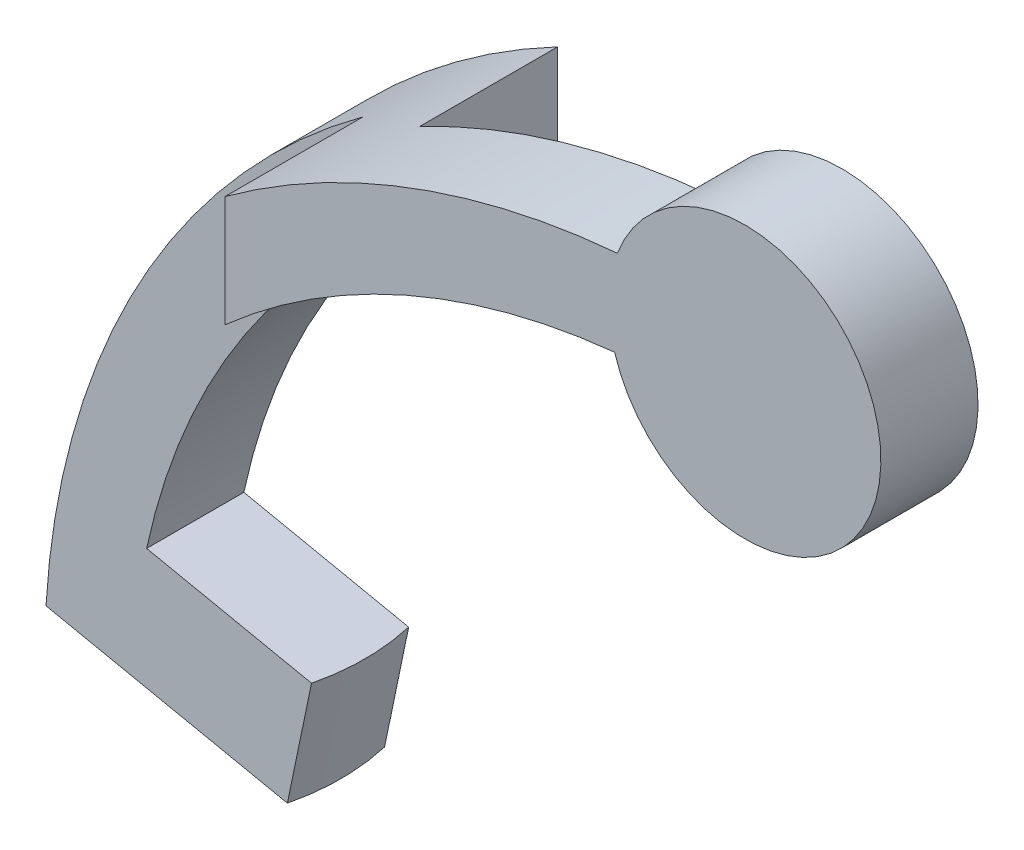
ISO-10303-21;
HEADER;
FILE_DESCRIPTION(('STEP AP214'),'2;1');
FILE_NAME('part.step','',(''),(''),'','','');
FILE_SCHEMA(('AUTOMOTIVE_DESIGN { 1 0 10303 214 1 1 1 1 }'));
ENDSEC;
DATA;
#1=APPLICATION_CONTEXT('core data for automotive mechanical design processes');
#2=APPLICATION_PROTOCOL_DEFINITION('international standard','automotive_design',2000,#1);
#3=PRODUCT_CONTEXT('',#1,'mechanical');
#4=PRODUCT('Part','Part','',(#3));
#5=PRODUCT_RELATED_PRODUCT_CATEGORY('part','',(#4));
#6=PRODUCT_DEFINITION_FORMATION('','',#4);
#7=PRODUCT_DEFINITION_CONTEXT('part definition',#1,'design');
#8=PRODUCT_DEFINITION('design','',#6,#7);
#9=PRODUCT_DEFINITION_SHAPE('','',#8);
#10=(LENGTH_UNIT() NAMED_UNIT(*) SI_UNIT(.MILLI.,.METRE.));
#11=(NAMED_UNIT(*) PLANE_ANGLE_UNIT() SI_UNIT($,.RADIAN.));
#12=(NAMED_UNIT(*) SI_UNIT($,.STERADIAN.) SOLID_ANGLE_UNIT());
#13=UNCERTAINTY_MEASURE_WITH_UNIT(LENGTH_MEASURE(1.E-05),#10,'distance_accuracy_value','');
#14=(GEOMETRIC_REPRESENTATION_CONTEXT(3) GLOBAL_UNCERTAINTY_ASSIGNED_CONTEXT((#13)) GLOBAL_UNIT_ASSIGNED_CONTEXT((#10,
#11,#12)) REPRESENTATION_CONTEXT('',''));
#15=CARTESIAN_POINT('',(0.,0.,0.));
#16=DIRECTION('',(0.,0.,1.));
#17=DIRECTION('',(1.,0.,0.));
#18=AXIS2_PLACEMENT_3D('',#15,#16,#17);
#19=CARTESIAN_POINT('',(-7.54083786418247,-36.2290461115529,-40.));
#20=DIRECTION('',(0.203776064234001,0.979017525708963,0.));
#21=DIRECTION('',(-0.979017525708963,0.203776064234001,0.));
#22=AXIS2_PLACEMENT_3D('',#19,#20,#21);
#23=PLANE('',#22);
#24=DIRECTION('',(-0.979017525708963,0.203776064234001,0.));
#25=VECTOR('',#24,1.);
#26=CARTESIAN_POINT('',(-7.54083786418248,-36.2290461115529,-2.10405816747473));
#27=LINE('',#26,#25);
#28=CARTESIAN_POINT('',(-29.399050280668,-31.6794028411766,-2.10405816747473));
#29=VERTEX_POINT('',#28);
#30=CARTESIAN_POINT('',(-37.8809726052462,-29.9139464493828,-2.10405816747473));
#31=VERTEX_POINT('',#30);
#32=EDGE_CURVE('E204',#29,#31,#27,.T.);
#33=ORIENTED_EDGE('',*,*,#32,.F.);
#34=CARTESIAN_POINT('',(-41.6473625302622,-29.129997137817,-4.60405816747473));
#35=DIRECTION('',(0.203776064234001,0.979017525708963,0.));
#36=DIRECTION('',(-0.979017525708963,0.203776064234001,0.));
#37=AXIS2_PLACEMENT_3D('',#34,#35,#36);
#38=CIRCLE('',#37,12.7581590523038);
#39=CARTESIAN_POINT('',(-29.399050280668,-31.6794028411766,-7.10405816747473));
#40=VERTEX_POINT('',#39);
#41=EDGE_CURVE('E49',#29,#40,#38,.T.);
#42=ORIENTED_EDGE('',*,*,#41,.T.);
#43=DIRECTION('',(-0.979017525708963,0.203776064234001,0.));
#44=VECTOR('',#43,1.);
#45=CARTESIAN_POINT('',(-7.54083786418247,-36.2290461115529,-7.10405816747473));
#46=LINE('',#45,#44);
#47=CARTESIAN_POINT('',(-37.8809726052462,-29.9139464493828,-7.10405816747473));
#48=VERTEX_POINT('',#47);
#49=EDGE_CURVE('E197',#40,#48,#46,.T.);
#50=ORIENTED_EDGE('',*,*,#49,.T.);
#51=DIRECTION('',(0.,0.,1.));
#52=VECTOR('',#51,1.);
#53=CARTESIAN_POINT('',(-37.8809726052462,-29.9139464493828,-40.));
#54=LINE('',#53,#52);
#55=EDGE_CURVE('E152',#48,#31,#54,.T.);
#56=ORIENTED_EDGE('',*,*,#55,.T.);
#57=EDGE_LOOP('',(#33,#42,#50,#56));
#58=FACE_BOUND('',#57,.T.);
#59=ADVANCED_FACE('F35',(#58),#23,.T.);
#60=CARTESIAN_POINT('',(-8.78245143456309,-42.1942287748356,-40.));
#61=DIRECTION('',(-0.203776064234002,-0.979017525708963,0.));
#62=DIRECTION('',(0.979017525708963,-0.203776064234002,0.));
#63=AXIS2_PLACEMENT_3D('',#60,#61,#62);
#64=PLANE('',#63);
#65=DIRECTION('',(0.979017525708963,-0.203776064234002,0.));
#66=VECTOR('',#65,1.);
#67=CARTESIAN_POINT('',(-8.78245143456309,-42.1942287748356,-7.10405816747473));
#68=LINE('',#67,#66);
#69=CARTESIAN_POINT('',(-43.0597148745306,-35.0596416473472,-7.10405816747473));
#70=VERTEX_POINT('',#69);
#71=CARTESIAN_POINT('',(-30.6406638510486,-37.6445855044593,-7.10405816747473));
#72=VERTEX_POINT('',#71);
#73=EDGE_CURVE('E131',#70,#72,#68,.T.);
#74=ORIENTED_EDGE('',*,*,#73,.T.);
#75=CARTESIAN_POINT('',(-42.8889761006428,-35.0951798010997,-4.60405816747473));
#76=DIRECTION('',(-0.203776064234002,-0.979017525708963,0.));
#77=DIRECTION('',(0.979017525708963,-0.203776064234002,0.));
#78=AXIS2_PLACEMENT_3D('',#75,#76,#77);
#79=CIRCLE('',#78,12.7581590523038);
#80=CARTESIAN_POINT('',(-30.6406638510486,-37.6445855044593,-2.10405816747473));
#81=VERTEX_POINT('',#80);
#82=EDGE_CURVE('E148',#72,#81,#79,.T.);
#83=ORIENTED_EDGE('',*,*,#82,.T.);
#84=DIRECTION('',(0.979017525708963,-0.203776064234002,0.));
#85=VECTOR('',#84,1.);
#86=CARTESIAN_POINT('',(-8.78245143456309,-42.1942287748356,-2.10405816747473));
#87=LINE('',#86,#85);
#88=CARTESIAN_POINT('',(-43.0597148745306,-35.0596416473472,-2.10405816747473));
#89=VERTEX_POINT('',#88);
#90=EDGE_CURVE('E43',#89,#81,#87,.T.);
#91=ORIENTED_EDGE('',*,*,#90,.F.);
#92=DIRECTION('',(0.,0.,1.));
#93=VECTOR('',#92,1.);
#94=CARTESIAN_POINT('',(-43.0597148745306,-35.0596416473472,-40.));
#95=LINE('',#94,#93);
#96=EDGE_CURVE('E147',#70,#89,#95,.T.);
#97=ORIENTED_EDGE('',*,*,#96,.F.);
#98=EDGE_LOOP('',(#74,#83,#91,#97));
#99=FACE_BOUND('',#98,.T.);
#100=ADVANCED_FACE('F146',(#99),#64,.T.);
#101=CARTESIAN_POINT('',(0.,5.,-7.10405816747473));
#102=DIRECTION('',(0.,0.,-1.));
#103=DIRECTION('',(-1.,0.,0.));
#104=AXIS2_PLACEMENT_3D('',#101,#102,#103);
#105=PLANE('',#104);
#106=ORIENTED_EDGE('',*,*,#49,.F.);
#107=DIRECTION('',(0.203776064234001,0.979017525708963,0.));
#108=VECTOR('',#107,1.);
#109=CARTESIAN_POINT('',(-31.1966493963986,-40.3157510065736,-7.10405816747473));
#110=LINE('',#109,#108);
#111=EDGE_CURVE('E215',#72,#40,#110,.T.);
#112=ORIENTED_EDGE('',*,*,#111,.F.);
#113=ORIENTED_EDGE('',*,*,#73,.F.);
#114=CARTESIAN_POINT('',(-3.12824808202929,-37.4001458236651,-7.10405816747473));
#115=DIRECTION('',(0.,0.,-1.));
#116=DIRECTION('',(-1.,0.,0.));
#117=AXIS2_PLACEMENT_3D('',#114,#115,#116);
#118=CIRCLE('',#117,40.);
#119=CARTESIAN_POINT('',(-21.7362276752908,-1.99191096993709,-7.10405816747473));
#120=VERTEX_POINT('',#119);
#121=EDGE_CURVE('E151',#70,#120,#118,.T.);
#122=ORIENTED_EDGE('',*,*,#121,.T.);
#123=DIRECTION('',(0.,-1.,0.));
#124=VECTOR('',#123,1.);
#125=CARTESIAN_POINT('',(-21.7362276752908,5.,-7.10405816747473));
#126=LINE('',#125,#124);
#127=CARTESIAN_POINT('',(-21.7362276752908,-7.10925382103718,-7.10405816747473));
#128=VERTEX_POINT('',#127);
#129=EDGE_CURVE('E190',#120,#128,#126,.T.);
#130=ORIENTED_EDGE('',*,*,#129,.T.);
#131=CARTESIAN_POINT('',(-3.12824808202929,-37.4001458236651,-7.10405816747473));
#132=DIRECTION('',(0.,0.,-1.));
#133=DIRECTION('',(-1.,0.,0.));
#134=AXIS2_PLACEMENT_3D('',#131,#132,#133);
#135=CIRCLE('',#134,35.5498951173995);
#136=EDGE_CURVE('E179',#128,#48,#135,.F.);
#137=ORIENTED_EDGE('',*,*,#136,.T.);
#138=EDGE_LOOP('',(#106,#112,#113,#122,#130,#137));
#139=FACE_BOUND('',#138,.T.);
#140=ADVANCED_FACE('F195',(#139),#105,.T.);
#141=CARTESIAN_POINT('',(0.,-37.8465318869941,-2.10405816747473));
#142=DIRECTION('',(0.,0.,-1.));
#143=DIRECTION('',(-1.,0.,0.));
#144=AXIS2_PLACEMENT_3D('',#141,#142,#143);
#145=PLANE('',#144);
#146=DIRECTION('',(0.203776064234001,0.979017525708963,0.));
#147=VECTOR('',#146,1.);
#148=CARTESIAN_POINT('',(-31.1966493963986,-40.3157510065736,-2.10405816747473));
#149=LINE('',#148,#147);
#150=EDGE_CURVE('E11',#29,#81,#149,.F.);
#151=ORIENTED_EDGE('',*,*,#150,.F.);
#152=ORIENTED_EDGE('',*,*,#32,.T.);
#153=CARTESIAN_POINT('',(-3.12824808202929,-37.4001458236651,-2.10405816747473));
#154=DIRECTION('',(0.,0.,-1.));
#155=DIRECTION('',(-1.,0.,0.));
#156=AXIS2_PLACEMENT_3D('',#153,#154,#155);
#157=CIRCLE('',#156,35.5498951173995);
#158=CARTESIAN_POINT('',(-26.7522213143074,-10.8350760594294,-2.10405816747473));
#159=VERTEX_POINT('',#158);
#160=EDGE_CURVE('E202',#159,#31,#157,.F.);
#161=ORIENTED_EDGE('',*,*,#160,.F.);
#162=DIRECTION('',(0.,1.,0.));
#163=VECTOR('',#162,1.);
#164=CARTESIAN_POINT('',(-26.7522213143074,-37.8465318869941,-2.10405816747473));
#165=LINE('',#164,#163);
#166=CARTESIAN_POINT('',(-26.7522213143074,-5.12154782560139,-2.10405816747473));
#167=VERTEX_POINT('',#166);
#168=EDGE_CURVE('E212',#159,#167,#165,.T.);
#169=ORIENTED_EDGE('',*,*,#168,.T.);
#170=CARTESIAN_POINT('',(-3.12824808202929,-37.4001458236651,-2.10405816747473));
#171=DIRECTION('',(0.,0.,-1.));
#172=DIRECTION('',(-1.,0.,0.));
#173=AXIS2_PLACEMENT_3D('',#170,#171,#172);
#174=CIRCLE('',#173,40.);
#175=EDGE_CURVE('E130',#89,#167,#174,.T.);
#176=ORIENTED_EDGE('',*,*,#175,.F.);
#177=ORIENTED_EDGE('',*,*,#90,.T.);
#178=EDGE_LOOP('',(#151,#152,#161,#169,#176,#177));
#179=FACE_BOUND('',#178,.T.);
#180=ADVANCED_FACE('F141',(#179),#145,.F.);
#181=CARTESIAN_POINT('',(-3.12824808202929,-37.4001458236651,45.));
#182=DIRECTION('',(0.,0.,-1.));
#183=DIRECTION('',(-1.,0.,0.));
#184=AXIS2_PLACEMENT_3D('',#181,#182,#183);
#185=CYLINDRICAL_SURFACE('',#184,35.5498951173995);
#186=CARTESIAN_POINT('',(-3.12824808202929,-37.4001458236651,5.));
#187=DIRECTION('',(0.,0.,-1.));
#188=DIRECTION('',(-1.,0.,0.));
#189=AXIS2_PLACEMENT_3D('',#186,#187,#188);
#190=CIRCLE('',#189,35.5498951173995);
#191=CARTESIAN_POINT('',(-6.69917083103431,-2.0300517669801,5.));
#192=VERTEX_POINT('',#191);
#193=CARTESIAN_POINT('',(-26.7522213143074,-10.8350760594294,5.00000000000001));
#194=VERTEX_POINT('',#193);
#195=EDGE_CURVE('E57',#192,#194,#190,.F.);
#196=ORIENTED_EDGE('',*,*,#195,.T.);
#197=DIRECTION('',(0.,0.,-1.));
#198=VECTOR('',#197,1.);
#199=CARTESIAN_POINT('',(-26.7522213143074,-10.8350760594294,45.));
#200=LINE('',#199,#198);
#201=EDGE_CURVE('E125',#159,#194,#200,.F.);
#202=ORIENTED_EDGE('',*,*,#201,.F.);
#203=ORIENTED_EDGE('',*,*,#160,.T.);
#204=ORIENTED_EDGE('',*,*,#55,.F.);
#205=ORIENTED_EDGE('',*,*,#136,.F.);
#206=DIRECTION('',(0.,0.,-1.));
#207=VECTOR('',#206,1.);
#208=CARTESIAN_POINT('',(-21.7362276752908,-7.10925382103718,45.));
#209=LINE('',#208,#207);
#210=CARTESIAN_POINT('',(-21.7362276752908,-7.10925382103718,0.));
#211=VERTEX_POINT('',#210);
#212=EDGE_CURVE('E156',#211,#128,#209,.T.);
#213=ORIENTED_EDGE('',*,*,#212,.F.);
#214=CARTESIAN_POINT('',(-3.12824808202929,-37.4001458236651,0.));
#215=DIRECTION('',(0.,0.,-1.));
#216=DIRECTION('',(-1.,0.,0.));
#217=AXIS2_PLACEMENT_3D('',#214,#215,#216);
#218=CIRCLE('',#217,35.5498951173995);
#219=CARTESIAN_POINT('',(-6.69917083103431,-2.0300517669801,0.));
#220=VERTEX_POINT('',#219);
#221=EDGE_CURVE('E178',#220,#211,#218,.F.);
#222=ORIENTED_EDGE('',*,*,#221,.F.);
#223=DIRECTION('',(0.,0.,-1.));
#224=VECTOR('',#223,1.);
#225=CARTESIAN_POINT('',(-6.69917083103431,-2.0300517669801,45.));
#226=LINE('',#225,#224);
#227=EDGE_CURVE('E163',#192,#220,#226,.T.);
#228=ORIENTED_EDGE('',*,*,#227,.F.);
#229=EDGE_LOOP('',(#196,#202,#203,#204,#205,#213,#222,#228));
#230=FACE_BOUND('',#229,.T.);
#231=ADVANCED_FACE('F199',(#230),#185,.F.);
#232=CARTESIAN_POINT('',(-3.12824808202929,-37.4001458236651,45.));
#233=DIRECTION('',(0.,0.,-1.));
#234=DIRECTION('',(-1.,0.,0.));
#235=AXIS2_PLACEMENT_3D('',#232,#233,#234);
#236=CYLINDRICAL_SURFACE('',#235,40.);
#237=DIRECTION('',(0.,0.,-1.));
#238=VECTOR('',#237,1.);
#239=CARTESIAN_POINT('',(-26.7522213143074,-5.12154782560139,45.));
#240=LINE('',#239,#238);
#241=CARTESIAN_POINT('',(-26.7522213143074,-5.12154782560139,5.00000000000001));
#242=VERTEX_POINT('',#241);
#243=EDGE_CURVE('E119',#242,#167,#240,.T.);
#244=ORIENTED_EDGE('',*,*,#243,.F.);
#245=CARTESIAN_POINT('',(-3.12824808202929,-37.4001458236651,5.));
#246=DIRECTION('',(0.,0.,-1.));
#247=DIRECTION('',(-1.,0.,0.));
#248=AXIS2_PLACEMENT_3D('',#245,#246,#247);
#249=CIRCLE('',#248,40.);
#250=CARTESIAN_POINT('',(-6.55624058274921,2.45269431872631,5.));
#251=VERTEX_POINT('',#250);
#252=EDGE_CURVE('E109',#242,#251,#249,.T.);
#253=ORIENTED_EDGE('',*,*,#252,.T.);
#254=DIRECTION('',(0.,0.,-1.));
#255=VECTOR('',#254,1.);
#256=CARTESIAN_POINT('',(-6.55624058274921,2.45269431872632,45.));
#257=LINE('',#256,#255);
#258=CARTESIAN_POINT('',(-6.55624058274921,2.4526943187263,0.));
#259=VERTEX_POINT('',#258);
#260=EDGE_CURVE('E161',#251,#259,#257,.T.);
#261=ORIENTED_EDGE('',*,*,#260,.T.);
#262=CARTESIAN_POINT('',(-3.12824808202929,-37.4001458236651,0.));
#263=DIRECTION('',(0.,0.,-1.));
#264=DIRECTION('',(-1.,0.,0.));
#265=AXIS2_PLACEMENT_3D('',#262,#263,#264);
#266=CIRCLE('',#265,40.);
#267=CARTESIAN_POINT('',(-21.7362276752908,-1.99191096993709,0.));
#268=VERTEX_POINT('',#267);
#269=EDGE_CURVE('E174',#268,#259,#266,.T.);
#270=ORIENTED_EDGE('',*,*,#269,.F.);
#271=DIRECTION('',(0.,0.,-1.));
#272=VECTOR('',#271,1.);
#273=CARTESIAN_POINT('',(-21.7362276752908,-1.99191096993709,45.));
#274=LINE('',#273,#272);
#275=EDGE_CURVE('E134',#120,#268,#274,.F.);
#276=ORIENTED_EDGE('',*,*,#275,.F.);
#277=ORIENTED_EDGE('',*,*,#121,.F.);
#278=ORIENTED_EDGE('',*,*,#96,.T.);
#279=ORIENTED_EDGE('',*,*,#175,.T.);
#280=EDGE_LOOP('',(#244,#253,#261,#270,#276,#277,#278,#279));
#281=FACE_BOUND('',#280,.T.);
#282=ADVANCED_FACE('F128',(#281),#236,.T.);
#283=CARTESIAN_POINT('',(-26.7522213143074,-37.8465318869941,0.));
#284=DIRECTION('',(-1.,0.,0.));
#285=DIRECTION('',(0.,0.,1.));
#286=AXIS2_PLACEMENT_3D('',#283,#284,#285);
#287=PLANE('',#286);
#288=DIRECTION('',(0.,-1.,0.));
#289=VECTOR('',#288,1.);
#290=CARTESIAN_POINT('',(-26.7522213143074,-37.8465318869941,5.00000000000001));
#291=LINE('',#290,#289);
#292=EDGE_CURVE('E112',#242,#194,#291,.T.);
#293=ORIENTED_EDGE('',*,*,#292,.F.);
#294=ORIENTED_EDGE('',*,*,#243,.T.);
#295=ORIENTED_EDGE('',*,*,#168,.F.);
#296=ORIENTED_EDGE('',*,*,#201,.T.);
#297=EDGE_LOOP('',(#293,#294,#295,#296));
#298=FACE_BOUND('',#297,.T.);
#299=ADVANCED_FACE('F122',(#298),#287,.T.);
#300=CARTESIAN_POINT('',(0.,0.,0.));
#301=DIRECTION('',(0.,0.,1.));
#302=DIRECTION('',(1.,0.,0.));
#303=AXIS2_PLACEMENT_3D('',#300,#301,#302);
#304=PLANE('',#303);
#305=ORIENTED_EDGE('',*,*,#269,.T.);
#306=CARTESIAN_POINT('',(0.,0.,0.));
#307=DIRECTION('',(0.,0.,1.));
#308=DIRECTION('',(1.,0.,0.));
#309=AXIS2_PLACEMENT_3D('',#306,#307,#308);
#310=CIRCLE('',#309,7.);
#311=EDGE_CURVE('E166',#220,#259,#310,.T.);
#312=ORIENTED_EDGE('',*,*,#311,.F.);
#313=ORIENTED_EDGE('',*,*,#221,.T.);
#314=DIRECTION('',(0.,-1.,0.));
#315=VECTOR('',#314,1.);
#316=CARTESIAN_POINT('',(-21.7362276752908,5.,0.));
#317=LINE('',#316,#315);
#318=EDGE_CURVE('E177',#268,#211,#317,.T.);
#319=ORIENTED_EDGE('',*,*,#318,.F.);
#320=EDGE_LOOP('',(#305,#312,#313,#319));
#321=FACE_BOUND('',#320,.T.);
#322=ADVANCED_FACE('F175',(#321),#304,.F.);
#323=CARTESIAN_POINT('',(0.,0.,5.));
#324=DIRECTION('',(0.,0.,-1.));
#325=DIRECTION('',(-1.,0.,0.));
#326=AXIS2_PLACEMENT_3D('',#323,#324,#325);
#327=CYLINDRICAL_SURFACE('',#326,7.);
#328=ORIENTED_EDGE('',*,*,#227,.T.);
#329=ORIENTED_EDGE('',*,*,#311,.T.);
#330=ORIENTED_EDGE('',*,*,#260,.F.);
#331=CARTESIAN_POINT('',(0.,0.,5.));
#332=DIRECTION('',(0.,0.,1.));
#333=DIRECTION('',(1.,0.,0.));
#334=AXIS2_PLACEMENT_3D('',#331,#332,#333);
#335=CIRCLE('',#334,7.);
#336=EDGE_CURVE('E114',#192,#251,#335,.T.);
#337=ORIENTED_EDGE('',*,*,#336,.F.);
#338=EDGE_LOOP('',(#328,#329,#330,#337));
#339=FACE_BOUND('',#338,.T.);
#340=ADVANCED_FACE('F37',(#339),#327,.T.);
#341=CARTESIAN_POINT('',(0.,0.,5.));
#342=DIRECTION('',(0.,0.,1.));
#343=DIRECTION('',(1.,0.,0.));
#344=AXIS2_PLACEMENT_3D('',#341,#342,#343);
#345=PLANE('',#344);
#346=ORIENTED_EDGE('',*,*,#336,.T.);
#347=ORIENTED_EDGE('',*,*,#252,.F.);
#348=ORIENTED_EDGE('',*,*,#292,.T.);
#349=ORIENTED_EDGE('',*,*,#195,.F.);
#350=EDGE_LOOP('',(#346,#347,#348,#349));
#351=FACE_BOUND('',#350,.T.);
#352=ADVANCED_FACE('F111',(#351),#345,.T.);
#353=CARTESIAN_POINT('',(-21.7362276752908,5.,5.));
#354=DIRECTION('',(1.,0.,0.));
#355=DIRECTION('',(0.,0.,-1.));
#356=AXIS2_PLACEMENT_3D('',#353,#354,#355);
#357=PLANE('',#356);
#358=ORIENTED_EDGE('',*,*,#212,.T.);
#359=ORIENTED_EDGE('',*,*,#129,.F.);
#360=ORIENTED_EDGE('',*,*,#275,.T.);
#361=ORIENTED_EDGE('',*,*,#318,.T.);
#362=EDGE_LOOP('',(#358,#359,#360,#361));
#363=FACE_BOUND('',#362,.T.);
#364=ADVANCED_FACE('F189',(#363),#357,.T.);
#365=CARTESIAN_POINT('',(-43.4449616459928,-37.766345303214,-4.60405816747473));
#366=DIRECTION('',(0.203776064234001,0.979017525708963,0.));
#367=DIRECTION('',(-0.979017525708963,0.203776064234001,0.));
#368=AXIS2_PLACEMENT_3D('',#365,#366,#367);
#369=CYLINDRICAL_SURFACE('',#368,12.7581590523038);
#370=ORIENTED_EDGE('',*,*,#111,.T.);
#371=ORIENTED_EDGE('',*,*,#41,.F.);
#372=ORIENTED_EDGE('',*,*,#150,.T.);
#373=ORIENTED_EDGE('',*,*,#82,.F.);
#374=EDGE_LOOP('',(#370,#371,#372,#373));
#375=FACE_BOUND('',#374,.T.);
#376=ADVANCED_FACE('F217',(#375),#369,.T.);
#377=CLOSED_SHELL('',(#59,#100,#140,#180,#231,#282,#299,#322,#340,#352,#364,#376));
#378=MANIFOLD_SOLID_BREP('B2',#377);
#379=ADVANCED_BREP_SHAPE_REPRESENTATION('',(#18,#378),#14);
#380=SHAPE_DEFINITION_REPRESENTATION(#9,#379);
ENDSEC;
END-ISO-10303-21;
